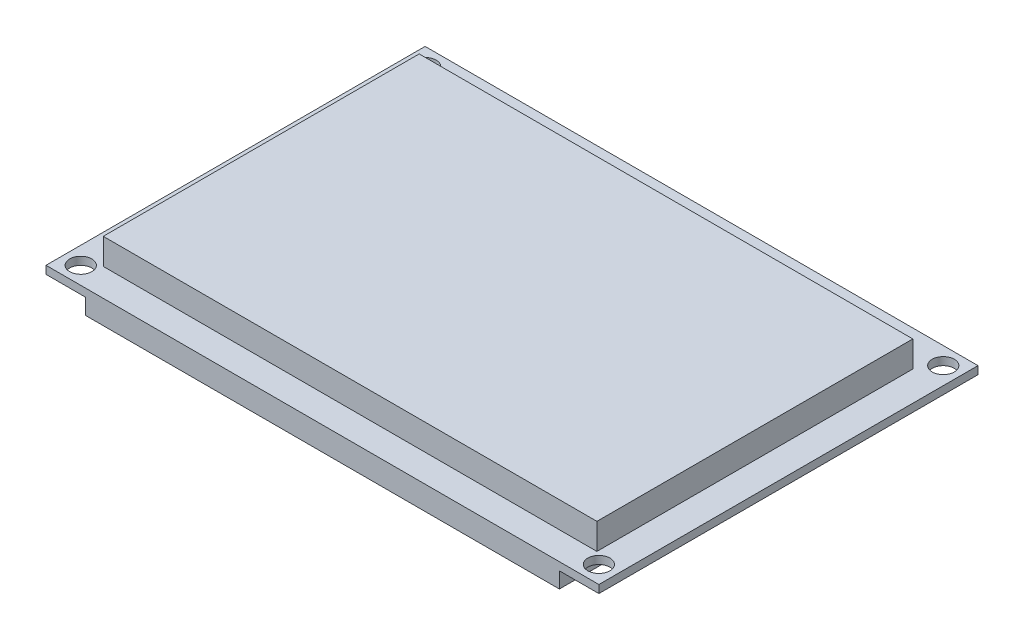
ISO-10303-21;
HEADER;
FILE_DESCRIPTION(('STEP AP214'),'2;1');
FILE_NAME('part.step','',(''),(''),'','','');
FILE_SCHEMA(('AUTOMOTIVE_DESIGN { 1 0 10303 214 1 1 1 1 }'));
ENDSEC;
DATA;
#1=APPLICATION_CONTEXT('core data for automotive mechanical design processes');
#2=APPLICATION_PROTOCOL_DEFINITION('international standard','automotive_design',2000,#1);
#3=PRODUCT_CONTEXT('',#1,'mechanical');
#4=PRODUCT('Part','Part','',(#3));
#5=PRODUCT_RELATED_PRODUCT_CATEGORY('part','',(#4));
#6=PRODUCT_DEFINITION_FORMATION('','',#4);
#7=PRODUCT_DEFINITION_CONTEXT('part definition',#1,'design');
#8=PRODUCT_DEFINITION('design','',#6,#7);
#9=PRODUCT_DEFINITION_SHAPE('','',#8);
#10=(LENGTH_UNIT() NAMED_UNIT(*) SI_UNIT(.MILLI.,.METRE.));
#11=(NAMED_UNIT(*) PLANE_ANGLE_UNIT() SI_UNIT($,.RADIAN.));
#12=(NAMED_UNIT(*) SI_UNIT($,.STERADIAN.) SOLID_ANGLE_UNIT());
#13=UNCERTAINTY_MEASURE_WITH_UNIT(LENGTH_MEASURE(1.E-05),#10,'distance_accuracy_value','');
#14=(GEOMETRIC_REPRESENTATION_CONTEXT(3) GLOBAL_UNCERTAINTY_ASSIGNED_CONTEXT((#13)) GLOBAL_UNIT_ASSIGNED_CONTEXT((#10,
#11,#12)) REPRESENTATION_CONTEXT('',''));
#15=CARTESIAN_POINT('',(0.,0.,0.));
#16=DIRECTION('',(0.,0.,1.));
#17=DIRECTION('',(1.,0.,0.));
#18=AXIS2_PLACEMENT_3D('',#15,#16,#17);
#19=CARTESIAN_POINT('',(0.,0.,0.));
#20=DIRECTION('',(0.,1.,0.));
#21=DIRECTION('',(0.,0.,1.));
#22=AXIS2_PLACEMENT_3D('',#19,#20,#21);
#23=PLANE('',#22);
#24=CARTESIAN_POINT('',(-2.2,0.,-45.8));
#25=DIRECTION('',(0.,1.,0.));
#26=DIRECTION('',(0.,0.,1.));
#27=AXIS2_PLACEMENT_3D('',#24,#25,#26);
#28=CIRCLE('',#27,1.4);
#29=CARTESIAN_POINT('',(-2.2,0.,-44.4));
#30=VERTEX_POINT('',#29);
#31=EDGE_CURVE('E263',#30,#30,#28,.T.);
#32=ORIENTED_EDGE('',*,*,#31,.T.);
#33=EDGE_LOOP('',(#32));
#34=FACE_BOUND('',#33,.T.);
#35=CARTESIAN_POINT('',(-2.2,0.,-2.19999999999999));
#36=DIRECTION('',(0.,1.,0.));
#37=DIRECTION('',(0.,0.,1.));
#38=AXIS2_PLACEMENT_3D('',#35,#36,#37);
#39=CIRCLE('',#38,1.4);
#40=CARTESIAN_POINT('',(-2.2,0.,-0.799999999999992));
#41=VERTEX_POINT('',#40);
#42=EDGE_CURVE('E260',#41,#41,#39,.T.);
#43=ORIENTED_EDGE('',*,*,#42,.T.);
#44=EDGE_LOOP('',(#43));
#45=FACE_BOUND('',#44,.T.);
#46=CARTESIAN_POINT('',(-67.8,0.,-2.19999999999999));
#47=DIRECTION('',(0.,1.,0.));
#48=DIRECTION('',(0.,0.,1.));
#49=AXIS2_PLACEMENT_3D('',#46,#47,#48);
#50=CIRCLE('',#49,1.4);
#51=CARTESIAN_POINT('',(-67.8,0.,-0.799999999999989));
#52=VERTEX_POINT('',#51);
#53=EDGE_CURVE('E257',#52,#52,#50,.T.);
#54=ORIENTED_EDGE('',*,*,#53,.T.);
#55=EDGE_LOOP('',(#54));
#56=FACE_BOUND('',#55,.T.);
#57=CARTESIAN_POINT('',(-67.8,0.,-45.8));
#58=DIRECTION('',(0.,1.,0.));
#59=DIRECTION('',(0.,0.,1.));
#60=AXIS2_PLACEMENT_3D('',#57,#58,#59);
#61=CIRCLE('',#60,1.4);
#62=CARTESIAN_POINT('',(-67.8,0.,-44.4));
#63=VERTEX_POINT('',#62);
#64=EDGE_CURVE('E254',#63,#63,#61,.T.);
#65=ORIENTED_EDGE('',*,*,#64,.T.);
#66=EDGE_LOOP('',(#65));
#67=FACE_BOUND('',#66,.T.);
#68=CARTESIAN_POINT('',(-38.6,0.,-45.2));
#69=DIRECTION('',(0.,1.,0.));
#70=DIRECTION('',(0.,0.,1.));
#71=AXIS2_PLACEMENT_3D('',#68,#69,#70);
#72=CIRCLE('',#71,0.499999999999999);
#73=CARTESIAN_POINT('',(-38.6,0.,-44.7));
#74=VERTEX_POINT('',#73);
#75=EDGE_CURVE('E251',#74,#74,#72,.T.);
#76=ORIENTED_EDGE('',*,*,#75,.T.);
#77=EDGE_LOOP('',(#76));
#78=FACE_BOUND('',#77,.T.);
#79=CARTESIAN_POINT('',(-36.2,0.,-45.2));
#80=DIRECTION('',(0.,1.,0.));
#81=DIRECTION('',(0.,0.,1.));
#82=AXIS2_PLACEMENT_3D('',#79,#80,#81);
#83=CIRCLE('',#82,0.499999999999999);
#84=CARTESIAN_POINT('',(-36.2,0.,-44.7));
#85=VERTEX_POINT('',#84);
#86=EDGE_CURVE('E248',#85,#85,#83,.T.);
#87=ORIENTED_EDGE('',*,*,#86,.T.);
#88=EDGE_LOOP('',(#87));
#89=FACE_BOUND('',#88,.T.);
#90=CARTESIAN_POINT('',(-33.8,0.,-45.2));
#91=DIRECTION('',(0.,1.,0.));
#92=DIRECTION('',(0.,0.,1.));
#93=AXIS2_PLACEMENT_3D('',#90,#91,#92);
#94=CIRCLE('',#93,0.499999999999999);
#95=CARTESIAN_POINT('',(-33.8,0.,-44.7));
#96=VERTEX_POINT('',#95);
#97=EDGE_CURVE('E245',#96,#96,#94,.T.);
#98=ORIENTED_EDGE('',*,*,#97,.T.);
#99=EDGE_LOOP('',(#98));
#100=FACE_BOUND('',#99,.T.);
#101=CARTESIAN_POINT('',(-31.4,0.,-45.2));
#102=DIRECTION('',(0.,1.,0.));
#103=DIRECTION('',(0.,0.,1.));
#104=AXIS2_PLACEMENT_3D('',#101,#102,#103);
#105=CIRCLE('',#104,0.499999999999999);
#106=CARTESIAN_POINT('',(-31.4,0.,-44.7));
#107=VERTEX_POINT('',#106);
#108=EDGE_CURVE('E242',#107,#107,#105,.T.);
#109=ORIENTED_EDGE('',*,*,#108,.T.);
#110=EDGE_LOOP('',(#109));
#111=FACE_BOUND('',#110,.T.);
#112=CARTESIAN_POINT('',(-68.2,0.,-27.6));
#113=DIRECTION('',(0.,1.,0.));
#114=DIRECTION('',(0.,0.,1.));
#115=AXIS2_PLACEMENT_3D('',#112,#113,#114);
#116=CIRCLE('',#115,0.499999999999999);
#117=CARTESIAN_POINT('',(-68.2,0.,-27.1));
#118=VERTEX_POINT('',#117);
#119=EDGE_CURVE('E239',#118,#118,#116,.T.);
#120=ORIENTED_EDGE('',*,*,#119,.T.);
#121=EDGE_LOOP('',(#120));
#122=FACE_BOUND('',#121,.T.);
#123=CARTESIAN_POINT('',(-68.2,0.,-25.2));
#124=DIRECTION('',(0.,1.,0.));
#125=DIRECTION('',(0.,0.,1.));
#126=AXIS2_PLACEMENT_3D('',#123,#124,#125);
#127=CIRCLE('',#126,0.499999999999999);
#128=CARTESIAN_POINT('',(-68.2,0.,-24.7));
#129=VERTEX_POINT('',#128);
#130=EDGE_CURVE('E236',#129,#129,#127,.T.);
#131=ORIENTED_EDGE('',*,*,#130,.T.);
#132=EDGE_LOOP('',(#131));
#133=FACE_BOUND('',#132,.T.);
#134=CARTESIAN_POINT('',(-68.2,0.,-22.8));
#135=DIRECTION('',(0.,1.,0.));
#136=DIRECTION('',(0.,0.,1.));
#137=AXIS2_PLACEMENT_3D('',#134,#135,#136);
#138=CIRCLE('',#137,0.499999999999999);
#139=CARTESIAN_POINT('',(-68.2,0.,-22.3));
#140=VERTEX_POINT('',#139);
#141=EDGE_CURVE('E233',#140,#140,#138,.T.);
#142=ORIENTED_EDGE('',*,*,#141,.T.);
#143=EDGE_LOOP('',(#142));
#144=FACE_BOUND('',#143,.T.);
#145=CARTESIAN_POINT('',(-68.2,0.,-20.4));
#146=DIRECTION('',(0.,1.,0.));
#147=DIRECTION('',(0.,0.,1.));
#148=AXIS2_PLACEMENT_3D('',#145,#146,#147);
#149=CIRCLE('',#148,0.499999999999999);
#150=CARTESIAN_POINT('',(-68.2,0.,-19.9));
#151=VERTEX_POINT('',#150);
#152=EDGE_CURVE('E181',#151,#151,#149,.T.);
#153=ORIENTED_EDGE('',*,*,#152,.T.);
#154=EDGE_LOOP('',(#153));
#155=FACE_BOUND('',#154,.T.);
#156=DIRECTION('',(0.,0.,-1.));
#157=VECTOR('',#156,1.);
#158=CARTESIAN_POINT('',(-65.,0.,-43.));
#159=LINE('',#158,#157);
#160=CARTESIAN_POINT('',(-65.,0.,0.));
#161=VERTEX_POINT('',#160);
#162=CARTESIAN_POINT('',(-65.,0.,-43.));
#163=VERTEX_POINT('',#162);
#164=EDGE_CURVE('E58',#161,#163,#159,.T.);
#165=ORIENTED_EDGE('',*,*,#164,.F.);
#166=DIRECTION('',(-1.,0.,0.));
#167=VECTOR('',#166,1.);
#168=CARTESIAN_POINT('',(0.,0.,0.));
#169=LINE('',#168,#167);
#170=CARTESIAN_POINT('',(-70.,0.,0.));
#171=VERTEX_POINT('',#170);
#172=EDGE_CURVE('E269',#161,#171,#169,.T.);
#173=ORIENTED_EDGE('',*,*,#172,.T.);
#174=DIRECTION('',(0.,0.,-1.));
#175=VECTOR('',#174,1.);
#176=CARTESIAN_POINT('',(-70.,0.,0.));
#177=LINE('',#176,#175);
#178=CARTESIAN_POINT('',(-70.,0.,-48.));
#179=VERTEX_POINT('',#178);
#180=EDGE_CURVE('E266',#171,#179,#177,.T.);
#181=ORIENTED_EDGE('',*,*,#180,.T.);
#182=DIRECTION('',(-1.,0.,0.));
#183=VECTOR('',#182,1.);
#184=CARTESIAN_POINT('',(0.,0.,-48.));
#185=LINE('',#184,#183);
#186=CARTESIAN_POINT('',(0.,0.,-48.));
#187=VERTEX_POINT('',#186);
#188=EDGE_CURVE('E186',#187,#179,#185,.T.);
#189=ORIENTED_EDGE('',*,*,#188,.F.);
#190=DIRECTION('',(0.,0.,-1.));
#191=VECTOR('',#190,1.);
#192=CARTESIAN_POINT('',(0.,0.,0.));
#193=LINE('',#192,#191);
#194=CARTESIAN_POINT('',(0.,0.,0.));
#195=VERTEX_POINT('',#194);
#196=EDGE_CURVE('E272',#195,#187,#193,.T.);
#197=ORIENTED_EDGE('',*,*,#196,.F.);
#198=CARTESIAN_POINT('',(-5.,0.,0.));
#199=VERTEX_POINT('',#198);
#200=EDGE_CURVE('E270',#195,#199,#169,.T.);
#201=ORIENTED_EDGE('',*,*,#200,.T.);
#202=DIRECTION('',(0.,0.,1.));
#203=VECTOR('',#202,1.);
#204=CARTESIAN_POINT('',(-5.,0.,-43.));
#205=LINE('',#204,#203);
#206=CARTESIAN_POINT('',(-5.,0.,-43.));
#207=VERTEX_POINT('',#206);
#208=EDGE_CURVE('E144',#207,#199,#205,.T.);
#209=ORIENTED_EDGE('',*,*,#208,.F.);
#210=DIRECTION('',(1.,0.,0.));
#211=VECTOR('',#210,1.);
#212=CARTESIAN_POINT('',(-65.,0.,-43.));
#213=LINE('',#212,#211);
#214=EDGE_CURVE('E53',#163,#207,#213,.T.);
#215=ORIENTED_EDGE('',*,*,#214,.F.);
#216=EDGE_LOOP('',(#165,#173,#181,#189,#197,#201,#209,#215));
#217=FACE_BOUND('',#216,.T.);
#218=ADVANCED_FACE('F38',(#34,#45,#56,#67,#78,#89,#100,#111,#122,#133,#144,#155,#217),#23,.F.);
#219=CARTESIAN_POINT('',(0.,1.,0.));
#220=DIRECTION('',(0.,1.,0.));
#221=DIRECTION('',(0.,0.,1.));
#222=AXIS2_PLACEMENT_3D('',#219,#220,#221);
#223=PLANE('',#222);
#224=CARTESIAN_POINT('',(-68.2,1.,-20.4));
#225=DIRECTION('',(0.,1.,0.));
#226=DIRECTION('',(0.,0.,1.));
#227=AXIS2_PLACEMENT_3D('',#224,#225,#226);
#228=CIRCLE('',#227,0.499999999999999);
#229=CARTESIAN_POINT('',(-68.2,1.,-19.9));
#230=VERTEX_POINT('',#229);
#231=EDGE_CURVE('E182',#230,#230,#228,.T.);
#232=ORIENTED_EDGE('',*,*,#231,.F.);
#233=EDGE_LOOP('',(#232));
#234=FACE_BOUND('',#233,.T.);
#235=CARTESIAN_POINT('',(-68.2,1.,-22.8));
#236=DIRECTION('',(0.,1.,0.));
#237=DIRECTION('',(0.,0.,1.));
#238=AXIS2_PLACEMENT_3D('',#235,#236,#237);
#239=CIRCLE('',#238,0.499999999999999);
#240=CARTESIAN_POINT('',(-68.2,1.,-22.3));
#241=VERTEX_POINT('',#240);
#242=EDGE_CURVE('E185',#241,#241,#239,.T.);
#243=ORIENTED_EDGE('',*,*,#242,.F.);
#244=EDGE_LOOP('',(#243));
#245=FACE_BOUND('',#244,.T.);
#246=CARTESIAN_POINT('',(-68.2,1.,-25.2));
#247=DIRECTION('',(0.,1.,0.));
#248=DIRECTION('',(0.,0.,1.));
#249=AXIS2_PLACEMENT_3D('',#246,#247,#248);
#250=CIRCLE('',#249,0.499999999999999);
#251=CARTESIAN_POINT('',(-68.2,1.,-24.7));
#252=VERTEX_POINT('',#251);
#253=EDGE_CURVE('E189',#252,#252,#250,.T.);
#254=ORIENTED_EDGE('',*,*,#253,.F.);
#255=EDGE_LOOP('',(#254));
#256=FACE_BOUND('',#255,.T.);
#257=CARTESIAN_POINT('',(-68.2,1.,-27.6));
#258=DIRECTION('',(0.,1.,0.));
#259=DIRECTION('',(0.,0.,1.));
#260=AXIS2_PLACEMENT_3D('',#257,#258,#259);
#261=CIRCLE('',#260,0.499999999999999);
#262=CARTESIAN_POINT('',(-68.2,1.,-27.1));
#263=VERTEX_POINT('',#262);
#264=EDGE_CURVE('E192',#263,#263,#261,.T.);
#265=ORIENTED_EDGE('',*,*,#264,.F.);
#266=EDGE_LOOP('',(#265));
#267=FACE_BOUND('',#266,.T.);
#268=CARTESIAN_POINT('',(-31.4,1.,-45.2));
#269=DIRECTION('',(0.,1.,0.));
#270=DIRECTION('',(0.,0.,1.));
#271=AXIS2_PLACEMENT_3D('',#268,#269,#270);
#272=CIRCLE('',#271,0.499999999999999);
#273=CARTESIAN_POINT('',(-31.4,1.,-44.7));
#274=VERTEX_POINT('',#273);
#275=EDGE_CURVE('E195',#274,#274,#272,.T.);
#276=ORIENTED_EDGE('',*,*,#275,.F.);
#277=EDGE_LOOP('',(#276));
#278=FACE_BOUND('',#277,.T.);
#279=CARTESIAN_POINT('',(-33.8,1.,-45.2));
#280=DIRECTION('',(0.,1.,0.));
#281=DIRECTION('',(0.,0.,1.));
#282=AXIS2_PLACEMENT_3D('',#279,#280,#281);
#283=CIRCLE('',#282,0.499999999999999);
#284=CARTESIAN_POINT('',(-33.8,1.,-44.7));
#285=VERTEX_POINT('',#284);
#286=EDGE_CURVE('E198',#285,#285,#283,.T.);
#287=ORIENTED_EDGE('',*,*,#286,.F.);
#288=EDGE_LOOP('',(#287));
#289=FACE_BOUND('',#288,.T.);
#290=CARTESIAN_POINT('',(-36.2,1.,-45.2));
#291=DIRECTION('',(0.,1.,0.));
#292=DIRECTION('',(0.,0.,1.));
#293=AXIS2_PLACEMENT_3D('',#290,#291,#292);
#294=CIRCLE('',#293,0.499999999999999);
#295=CARTESIAN_POINT('',(-36.2,1.,-44.7));
#296=VERTEX_POINT('',#295);
#297=EDGE_CURVE('E201',#296,#296,#294,.T.);
#298=ORIENTED_EDGE('',*,*,#297,.F.);
#299=EDGE_LOOP('',(#298));
#300=FACE_BOUND('',#299,.T.);
#301=CARTESIAN_POINT('',(-38.6,1.,-45.2));
#302=DIRECTION('',(0.,1.,0.));
#303=DIRECTION('',(0.,0.,1.));
#304=AXIS2_PLACEMENT_3D('',#301,#302,#303);
#305=CIRCLE('',#304,0.499999999999999);
#306=CARTESIAN_POINT('',(-38.6,1.,-44.7));
#307=VERTEX_POINT('',#306);
#308=EDGE_CURVE('E204',#307,#307,#305,.T.);
#309=ORIENTED_EDGE('',*,*,#308,.F.);
#310=EDGE_LOOP('',(#309));
#311=FACE_BOUND('',#310,.T.);
#312=CARTESIAN_POINT('',(-67.8,1.,-45.8));
#313=DIRECTION('',(0.,1.,0.));
#314=DIRECTION('',(0.,0.,1.));
#315=AXIS2_PLACEMENT_3D('',#312,#313,#314);
#316=CIRCLE('',#315,1.4);
#317=CARTESIAN_POINT('',(-67.8,1.,-44.4));
#318=VERTEX_POINT('',#317);
#319=EDGE_CURVE('E207',#318,#318,#316,.T.);
#320=ORIENTED_EDGE('',*,*,#319,.F.);
#321=EDGE_LOOP('',(#320));
#322=FACE_BOUND('',#321,.T.);
#323=CARTESIAN_POINT('',(-67.8,1.,-2.19999999999999));
#324=DIRECTION('',(0.,1.,0.));
#325=DIRECTION('',(0.,0.,1.));
#326=AXIS2_PLACEMENT_3D('',#323,#324,#325);
#327=CIRCLE('',#326,1.4);
#328=CARTESIAN_POINT('',(-67.8,1.,-0.799999999999989));
#329=VERTEX_POINT('',#328);
#330=EDGE_CURVE('E210',#329,#329,#327,.T.);
#331=ORIENTED_EDGE('',*,*,#330,.F.);
#332=EDGE_LOOP('',(#331));
#333=FACE_BOUND('',#332,.T.);
#334=CARTESIAN_POINT('',(-2.2,1.,-2.19999999999999));
#335=DIRECTION('',(0.,1.,0.));
#336=DIRECTION('',(0.,0.,1.));
#337=AXIS2_PLACEMENT_3D('',#334,#335,#336);
#338=CIRCLE('',#337,1.4);
#339=CARTESIAN_POINT('',(-2.2,1.,-0.799999999999992));
#340=VERTEX_POINT('',#339);
#341=EDGE_CURVE('E213',#340,#340,#338,.T.);
#342=ORIENTED_EDGE('',*,*,#341,.F.);
#343=EDGE_LOOP('',(#342));
#344=FACE_BOUND('',#343,.T.);
#345=CARTESIAN_POINT('',(-2.2,1.,-45.8));
#346=DIRECTION('',(0.,1.,0.));
#347=DIRECTION('',(0.,0.,1.));
#348=AXIS2_PLACEMENT_3D('',#345,#346,#347);
#349=CIRCLE('',#348,1.4);
#350=CARTESIAN_POINT('',(-2.2,1.,-44.4));
#351=VERTEX_POINT('',#350);
#352=EDGE_CURVE('E216',#351,#351,#349,.T.);
#353=ORIENTED_EDGE('',*,*,#352,.F.);
#354=EDGE_LOOP('',(#353));
#355=FACE_BOUND('',#354,.T.);
#356=DIRECTION('',(0.,0.,-1.));
#357=VECTOR('',#356,1.);
#358=CARTESIAN_POINT('',(-70.,1.,0.));
#359=LINE('',#358,#357);
#360=CARTESIAN_POINT('',(-70.,1.,0.));
#361=VERTEX_POINT('',#360);
#362=CARTESIAN_POINT('',(-70.,1.,-48.));
#363=VERTEX_POINT('',#362);
#364=EDGE_CURVE('E219',#361,#363,#359,.T.);
#365=ORIENTED_EDGE('',*,*,#364,.F.);
#366=DIRECTION('',(-1.,0.,0.));
#367=VECTOR('',#366,1.);
#368=CARTESIAN_POINT('',(0.,1.,0.));
#369=LINE('',#368,#367);
#370=CARTESIAN_POINT('',(0.,1.,0.));
#371=VERTEX_POINT('',#370);
#372=EDGE_CURVE('E222',#371,#361,#369,.T.);
#373=ORIENTED_EDGE('',*,*,#372,.F.);
#374=DIRECTION('',(0.,0.,-1.));
#375=VECTOR('',#374,1.);
#376=CARTESIAN_POINT('',(0.,1.,0.));
#377=LINE('',#376,#375);
#378=CARTESIAN_POINT('',(0.,1.,-48.));
#379=VERTEX_POINT('',#378);
#380=EDGE_CURVE('E225',#371,#379,#377,.T.);
#381=ORIENTED_EDGE('',*,*,#380,.T.);
#382=DIRECTION('',(-1.,0.,0.));
#383=VECTOR('',#382,1.);
#384=CARTESIAN_POINT('',(0.,1.,-48.));
#385=LINE('',#384,#383);
#386=EDGE_CURVE('E228',#379,#363,#385,.T.);
#387=ORIENTED_EDGE('',*,*,#386,.T.);
#388=EDGE_LOOP('',(#365,#373,#381,#387));
#389=FACE_BOUND('',#388,.T.);
#390=DIRECTION('',(1.,0.,0.));
#391=VECTOR('',#390,1.);
#392=CARTESIAN_POINT('',(-66.25,1.,-3.49999999999999));
#393=LINE('',#392,#391);
#394=CARTESIAN_POINT('',(-66.25,1.,-3.49999999999999));
#395=VERTEX_POINT('',#394);
#396=CARTESIAN_POINT('',(-3.75,1.,-3.49999999999999));
#397=VERTEX_POINT('',#396);
#398=EDGE_CURVE('E150',#395,#397,#393,.T.);
#399=ORIENTED_EDGE('',*,*,#398,.F.);
#400=DIRECTION('',(0.,0.,1.));
#401=VECTOR('',#400,1.);
#402=CARTESIAN_POINT('',(-66.25,1.,-43.5));
#403=LINE('',#402,#401);
#404=CARTESIAN_POINT('',(-66.25,1.,-43.5));
#405=VERTEX_POINT('',#404);
#406=EDGE_CURVE('E147',#405,#395,#403,.T.);
#407=ORIENTED_EDGE('',*,*,#406,.F.);
#408=DIRECTION('',(-1.,0.,0.));
#409=VECTOR('',#408,1.);
#410=CARTESIAN_POINT('',(-66.25,1.,-43.5));
#411=LINE('',#410,#409);
#412=CARTESIAN_POINT('',(-3.75,1.,-43.5));
#413=VERTEX_POINT('',#412);
#414=EDGE_CURVE('E160',#413,#405,#411,.T.);
#415=ORIENTED_EDGE('',*,*,#414,.F.);
#416=DIRECTION('',(0.,0.,-1.));
#417=VECTOR('',#416,1.);
#418=CARTESIAN_POINT('',(-3.75,1.,-43.5));
#419=LINE('',#418,#417);
#420=EDGE_CURVE('E168',#397,#413,#419,.T.);
#421=ORIENTED_EDGE('',*,*,#420,.F.);
#422=EDGE_LOOP('',(#399,#407,#415,#421));
#423=FACE_BOUND('',#422,.T.);
#424=ADVANCED_FACE('F310',(#234,#245,#256,#267,#278,#289,#300,#311,#322,#333,#344,#355,#389,
#423),#223,.T.);
#425=CARTESIAN_POINT('',(-70.,1.,0.));
#426=DIRECTION('',(-1.,0.,0.));
#427=DIRECTION('',(0.,0.,1.));
#428=AXIS2_PLACEMENT_3D('',#425,#426,#427);
#429=PLANE('',#428);
#430=ORIENTED_EDGE('',*,*,#180,.F.);
#431=DIRECTION('',(0.,-1.,0.));
#432=VECTOR('',#431,1.);
#433=CARTESIAN_POINT('',(-70.,1.,0.));
#434=LINE('',#433,#432);
#435=EDGE_CURVE('E11',#361,#171,#434,.T.);
#436=ORIENTED_EDGE('',*,*,#435,.F.);
#437=ORIENTED_EDGE('',*,*,#364,.T.);
#438=DIRECTION('',(0.,-1.,0.));
#439=VECTOR('',#438,1.);
#440=CARTESIAN_POINT('',(-70.,1.,-48.));
#441=LINE('',#440,#439);
#442=EDGE_CURVE('E230',#363,#179,#441,.T.);
#443=ORIENTED_EDGE('',*,*,#442,.T.);
#444=EDGE_LOOP('',(#430,#436,#437,#443));
#445=FACE_BOUND('',#444,.T.);
#446=ADVANCED_FACE('F316',(#445),#429,.T.);
#447=CARTESIAN_POINT('',(0.,1.,0.));
#448=DIRECTION('',(0.,0.,1.));
#449=DIRECTION('',(1.,0.,0.));
#450=AXIS2_PLACEMENT_3D('',#447,#448,#449);
#451=PLANE('',#450);
#452=ORIENTED_EDGE('',*,*,#200,.F.);
#453=DIRECTION('',(0.,-1.,0.));
#454=VECTOR('',#453,1.);
#455=CARTESIAN_POINT('',(0.,1.,0.));
#456=LINE('',#455,#454);
#457=EDGE_CURVE('E46',#371,#195,#456,.T.);
#458=ORIENTED_EDGE('',*,*,#457,.F.);
#459=ORIENTED_EDGE('',*,*,#372,.T.);
#460=ORIENTED_EDGE('',*,*,#435,.T.);
#461=ORIENTED_EDGE('',*,*,#172,.F.);
#462=DIRECTION('',(0.,1.,0.));
#463=VECTOR('',#462,1.);
#464=CARTESIAN_POINT('',(-65.,-2.,0.));
#465=LINE('',#464,#463);
#466=CARTESIAN_POINT('',(-65.,-2.,0.));
#467=VERTEX_POINT('',#466);
#468=EDGE_CURVE('E293',#467,#161,#465,.T.);
#469=ORIENTED_EDGE('',*,*,#468,.F.);
#470=DIRECTION('',(-1.,0.,0.));
#471=VECTOR('',#470,1.);
#472=CARTESIAN_POINT('',(-65.,-2.,0.));
#473=LINE('',#472,#471);
#474=CARTESIAN_POINT('',(-5.,-2.,0.));
#475=VERTEX_POINT('',#474);
#476=EDGE_CURVE('E140',#475,#467,#473,.T.);
#477=ORIENTED_EDGE('',*,*,#476,.F.);
#478=DIRECTION('',(0.,1.,0.));
#479=VECTOR('',#478,1.);
#480=CARTESIAN_POINT('',(-5.,-2.,0.));
#481=LINE('',#480,#479);
#482=EDGE_CURVE('E152',#475,#199,#481,.T.);
#483=ORIENTED_EDGE('',*,*,#482,.T.);
#484=EDGE_LOOP('',(#452,#458,#459,#460,#461,#469,#477,#483));
#485=FACE_BOUND('',#484,.T.);
#486=ADVANCED_FACE('F290',(#485),#451,.T.);
#487=CARTESIAN_POINT('',(0.,1.,0.));
#488=DIRECTION('',(-1.,0.,0.));
#489=DIRECTION('',(0.,0.,1.));
#490=AXIS2_PLACEMENT_3D('',#487,#488,#489);
#491=PLANE('',#490);
#492=ORIENTED_EDGE('',*,*,#196,.T.);
#493=DIRECTION('',(0.,-1.,0.));
#494=VECTOR('',#493,1.);
#495=CARTESIAN_POINT('',(0.,1.,-48.));
#496=LINE('',#495,#494);
#497=EDGE_CURVE('E278',#379,#187,#496,.T.);
#498=ORIENTED_EDGE('',*,*,#497,.F.);
#499=ORIENTED_EDGE('',*,*,#380,.F.);
#500=ORIENTED_EDGE('',*,*,#457,.T.);
#501=EDGE_LOOP('',(#492,#498,#499,#500));
#502=FACE_BOUND('',#501,.T.);
#503=ADVANCED_FACE('F283',(#502),#491,.F.);
#504=CARTESIAN_POINT('',(-2.2,1.,-45.8));
#505=DIRECTION('',(0.,-1.,0.));
#506=DIRECTION('',(0.,0.,-1.));
#507=AXIS2_PLACEMENT_3D('',#504,#505,#506);
#508=CYLINDRICAL_SURFACE('',#507,1.4);
#509=ORIENTED_EDGE('',*,*,#352,.T.);
#510=EDGE_LOOP('',(#509));
#511=FACE_BOUND('',#510,.T.);
#512=ORIENTED_EDGE('',*,*,#31,.F.);
#513=EDGE_LOOP('',(#512));
#514=FACE_BOUND('',#513,.T.);
#515=ADVANCED_FACE('F329',(#511,#514),#508,.F.);
#516=CARTESIAN_POINT('',(-2.2,1.,-2.19999999999999));
#517=DIRECTION('',(0.,-1.,0.));
#518=DIRECTION('',(0.,0.,-1.));
#519=AXIS2_PLACEMENT_3D('',#516,#517,#518);
#520=CYLINDRICAL_SURFACE('',#519,1.4);
#521=ORIENTED_EDGE('',*,*,#341,.T.);
#522=EDGE_LOOP('',(#521));
#523=FACE_BOUND('',#522,.T.);
#524=ORIENTED_EDGE('',*,*,#42,.F.);
#525=EDGE_LOOP('',(#524));
#526=FACE_BOUND('',#525,.T.);
#527=ADVANCED_FACE('F337',(#523,#526),#520,.F.);
#528=CARTESIAN_POINT('',(-67.8,1.,-2.19999999999999));
#529=DIRECTION('',(0.,-1.,0.));
#530=DIRECTION('',(0.,0.,-1.));
#531=AXIS2_PLACEMENT_3D('',#528,#529,#530);
#532=CYLINDRICAL_SURFACE('',#531,1.4);
#533=ORIENTED_EDGE('',*,*,#330,.T.);
#534=EDGE_LOOP('',(#533));
#535=FACE_BOUND('',#534,.T.);
#536=ORIENTED_EDGE('',*,*,#53,.F.);
#537=EDGE_LOOP('',(#536));
#538=FACE_BOUND('',#537,.T.);
#539=ADVANCED_FACE('F341',(#535,#538),#532,.F.);
#540=CARTESIAN_POINT('',(-67.8,1.,-45.8));
#541=DIRECTION('',(0.,-1.,0.));
#542=DIRECTION('',(0.,0.,-1.));
#543=AXIS2_PLACEMENT_3D('',#540,#541,#542);
#544=CYLINDRICAL_SURFACE('',#543,1.4);
#545=ORIENTED_EDGE('',*,*,#319,.T.);
#546=EDGE_LOOP('',(#545));
#547=FACE_BOUND('',#546,.T.);
#548=ORIENTED_EDGE('',*,*,#64,.F.);
#549=EDGE_LOOP('',(#548));
#550=FACE_BOUND('',#549,.T.);
#551=ADVANCED_FACE('F345',(#547,#550),#544,.F.);
#552=CARTESIAN_POINT('',(-38.6,1.,-45.2));
#553=DIRECTION('',(0.,-1.,0.));
#554=DIRECTION('',(0.,0.,-1.));
#555=AXIS2_PLACEMENT_3D('',#552,#553,#554);
#556=CYLINDRICAL_SURFACE('',#555,0.499999999999999);
#557=ORIENTED_EDGE('',*,*,#308,.T.);
#558=EDGE_LOOP('',(#557));
#559=FACE_BOUND('',#558,.T.);
#560=ORIENTED_EDGE('',*,*,#75,.F.);
#561=EDGE_LOOP('',(#560));
#562=FACE_BOUND('',#561,.T.);
#563=ADVANCED_FACE('F349',(#559,#562),#556,.F.);
#564=CARTESIAN_POINT('',(-36.2,1.,-45.2));
#565=DIRECTION('',(0.,-1.,0.));
#566=DIRECTION('',(0.,0.,-1.));
#567=AXIS2_PLACEMENT_3D('',#564,#565,#566);
#568=CYLINDRICAL_SURFACE('',#567,0.499999999999999);
#569=ORIENTED_EDGE('',*,*,#297,.T.);
#570=EDGE_LOOP('',(#569));
#571=FACE_BOUND('',#570,.T.);
#572=ORIENTED_EDGE('',*,*,#86,.F.);
#573=EDGE_LOOP('',(#572));
#574=FACE_BOUND('',#573,.T.);
#575=ADVANCED_FACE('F353',(#571,#574),#568,.F.);
#576=CARTESIAN_POINT('',(-33.8,1.,-45.2));
#577=DIRECTION('',(0.,-1.,0.));
#578=DIRECTION('',(0.,0.,-1.));
#579=AXIS2_PLACEMENT_3D('',#576,#577,#578);
#580=CYLINDRICAL_SURFACE('',#579,0.499999999999999);
#581=ORIENTED_EDGE('',*,*,#286,.T.);
#582=EDGE_LOOP('',(#581));
#583=FACE_BOUND('',#582,.T.);
#584=ORIENTED_EDGE('',*,*,#97,.F.);
#585=EDGE_LOOP('',(#584));
#586=FACE_BOUND('',#585,.T.);
#587=ADVANCED_FACE('F357',(#583,#586),#580,.F.);
#588=CARTESIAN_POINT('',(-31.4,1.,-45.2));
#589=DIRECTION('',(0.,-1.,0.));
#590=DIRECTION('',(0.,0.,-1.));
#591=AXIS2_PLACEMENT_3D('',#588,#589,#590);
#592=CYLINDRICAL_SURFACE('',#591,0.499999999999999);
#593=ORIENTED_EDGE('',*,*,#275,.T.);
#594=EDGE_LOOP('',(#593));
#595=FACE_BOUND('',#594,.T.);
#596=ORIENTED_EDGE('',*,*,#108,.F.);
#597=EDGE_LOOP('',(#596));
#598=FACE_BOUND('',#597,.T.);
#599=ADVANCED_FACE('F361',(#595,#598),#592,.F.);
#600=CARTESIAN_POINT('',(-68.2,1.,-27.6));
#601=DIRECTION('',(0.,-1.,0.));
#602=DIRECTION('',(0.,0.,-1.));
#603=AXIS2_PLACEMENT_3D('',#600,#601,#602);
#604=CYLINDRICAL_SURFACE('',#603,0.499999999999999);
#605=ORIENTED_EDGE('',*,*,#264,.T.);
#606=EDGE_LOOP('',(#605));
#607=FACE_BOUND('',#606,.T.);
#608=ORIENTED_EDGE('',*,*,#119,.F.);
#609=EDGE_LOOP('',(#608));
#610=FACE_BOUND('',#609,.T.);
#611=ADVANCED_FACE('F365',(#607,#610),#604,.F.);
#612=CARTESIAN_POINT('',(-68.2,1.,-25.2));
#613=DIRECTION('',(0.,-1.,0.));
#614=DIRECTION('',(0.,0.,-1.));
#615=AXIS2_PLACEMENT_3D('',#612,#613,#614);
#616=CYLINDRICAL_SURFACE('',#615,0.499999999999999);
#617=ORIENTED_EDGE('',*,*,#253,.T.);
#618=EDGE_LOOP('',(#617));
#619=FACE_BOUND('',#618,.T.);
#620=ORIENTED_EDGE('',*,*,#130,.F.);
#621=EDGE_LOOP('',(#620));
#622=FACE_BOUND('',#621,.T.);
#623=ADVANCED_FACE('F369',(#619,#622),#616,.F.);
#624=CARTESIAN_POINT('',(-68.2,1.,-22.8));
#625=DIRECTION('',(0.,-1.,0.));
#626=DIRECTION('',(0.,0.,-1.));
#627=AXIS2_PLACEMENT_3D('',#624,#625,#626);
#628=CYLINDRICAL_SURFACE('',#627,0.499999999999999);
#629=ORIENTED_EDGE('',*,*,#242,.T.);
#630=EDGE_LOOP('',(#629));
#631=FACE_BOUND('',#630,.T.);
#632=ORIENTED_EDGE('',*,*,#141,.F.);
#633=EDGE_LOOP('',(#632));
#634=FACE_BOUND('',#633,.T.);
#635=ADVANCED_FACE('F372',(#631,#634),#628,.F.);
#636=CARTESIAN_POINT('',(-68.2,1.,-20.4));
#637=DIRECTION('',(0.,-1.,0.));
#638=DIRECTION('',(0.,0.,-1.));
#639=AXIS2_PLACEMENT_3D('',#636,#637,#638);
#640=CYLINDRICAL_SURFACE('',#639,0.499999999999999);
#641=ORIENTED_EDGE('',*,*,#231,.T.);
#642=EDGE_LOOP('',(#641));
#643=FACE_BOUND('',#642,.T.);
#644=ORIENTED_EDGE('',*,*,#152,.F.);
#645=EDGE_LOOP('',(#644));
#646=FACE_BOUND('',#645,.T.);
#647=ADVANCED_FACE('F40',(#643,#646),#640,.F.);
#648=CARTESIAN_POINT('',(0.,1.,-48.));
#649=DIRECTION('',(0.,0.,1.));
#650=DIRECTION('',(1.,0.,0.));
#651=AXIS2_PLACEMENT_3D('',#648,#649,#650);
#652=PLANE('',#651);
#653=ORIENTED_EDGE('',*,*,#188,.T.);
#654=ORIENTED_EDGE('',*,*,#442,.F.);
#655=ORIENTED_EDGE('',*,*,#386,.F.);
#656=ORIENTED_EDGE('',*,*,#497,.T.);
#657=EDGE_LOOP('',(#653,#654,#655,#656));
#658=FACE_BOUND('',#657,.T.);
#659=ADVANCED_FACE('F322',(#658),#652,.F.);
#660=CARTESIAN_POINT('',(-66.25,4.3,-43.5));
#661=DIRECTION('',(1.,0.,0.));
#662=DIRECTION('',(0.,0.,-1.));
#663=AXIS2_PLACEMENT_3D('',#660,#661,#662);
#664=PLANE('',#663);
#665=ORIENTED_EDGE('',*,*,#406,.T.);
#666=DIRECTION('',(0.,-1.,0.));
#667=VECTOR('',#666,1.);
#668=CARTESIAN_POINT('',(-66.25,4.3,-3.49999999999999));
#669=LINE('',#668,#667);
#670=CARTESIAN_POINT('',(-66.25,4.3,-3.49999999999999));
#671=VERTEX_POINT('',#670);
#672=EDGE_CURVE('E179',#671,#395,#669,.T.);
#673=ORIENTED_EDGE('',*,*,#672,.F.);
#674=DIRECTION('',(0.,0.,1.));
#675=VECTOR('',#674,1.);
#676=CARTESIAN_POINT('',(-66.25,4.3,-43.5));
#677=LINE('',#676,#675);
#678=CARTESIAN_POINT('',(-66.25,4.3,-43.5));
#679=VERTEX_POINT('',#678);
#680=EDGE_CURVE('E156',#679,#671,#677,.T.);
#681=ORIENTED_EDGE('',*,*,#680,.F.);
#682=DIRECTION('',(0.,-1.,0.));
#683=VECTOR('',#682,1.);
#684=CARTESIAN_POINT('',(-66.25,4.3,-43.5));
#685=LINE('',#684,#683);
#686=EDGE_CURVE('E165',#679,#405,#685,.T.);
#687=ORIENTED_EDGE('',*,*,#686,.T.);
#688=EDGE_LOOP('',(#665,#673,#681,#687));
#689=FACE_BOUND('',#688,.T.);
#690=ADVANCED_FACE('F325',(#689),#664,.F.);
#691=CARTESIAN_POINT('',(-66.25,4.3,-3.49999999999999));
#692=DIRECTION('',(0.,0.,-1.));
#693=DIRECTION('',(-1.,0.,0.));
#694=AXIS2_PLACEMENT_3D('',#691,#692,#693);
#695=PLANE('',#694);
#696=ORIENTED_EDGE('',*,*,#398,.T.);
#697=DIRECTION('',(0.,-1.,0.));
#698=VECTOR('',#697,1.);
#699=CARTESIAN_POINT('',(-3.75,4.3,-3.49999999999999));
#700=LINE('',#699,#698);
#701=CARTESIAN_POINT('',(-3.75,4.3,-3.49999999999999));
#702=VERTEX_POINT('',#701);
#703=EDGE_CURVE('E176',#702,#397,#700,.T.);
#704=ORIENTED_EDGE('',*,*,#703,.F.);
#705=DIRECTION('',(1.,0.,0.));
#706=VECTOR('',#705,1.);
#707=CARTESIAN_POINT('',(-66.25,4.3,-3.49999999999999));
#708=LINE('',#707,#706);
#709=EDGE_CURVE('E159',#671,#702,#708,.T.);
#710=ORIENTED_EDGE('',*,*,#709,.F.);
#711=ORIENTED_EDGE('',*,*,#672,.T.);
#712=EDGE_LOOP('',(#696,#704,#710,#711));
#713=FACE_BOUND('',#712,.T.);
#714=ADVANCED_FACE('F417',(#713),#695,.F.);
#715=CARTESIAN_POINT('',(-3.75,4.3,-43.5));
#716=DIRECTION('',(-1.,0.,0.));
#717=DIRECTION('',(0.,0.,1.));
#718=AXIS2_PLACEMENT_3D('',#715,#716,#717);
#719=PLANE('',#718);
#720=ORIENTED_EDGE('',*,*,#420,.T.);
#721=DIRECTION('',(0.,-1.,0.));
#722=VECTOR('',#721,1.);
#723=CARTESIAN_POINT('',(-3.75,4.3,-43.5));
#724=LINE('',#723,#722);
#725=CARTESIAN_POINT('',(-3.75,4.3,-43.5));
#726=VERTEX_POINT('',#725);
#727=EDGE_CURVE('E174',#726,#413,#724,.T.);
#728=ORIENTED_EDGE('',*,*,#727,.F.);
#729=DIRECTION('',(0.,0.,-1.));
#730=VECTOR('',#729,1.);
#731=CARTESIAN_POINT('',(-3.75,4.3,-43.5));
#732=LINE('',#731,#730);
#733=EDGE_CURVE('E162',#702,#726,#732,.T.);
#734=ORIENTED_EDGE('',*,*,#733,.F.);
#735=ORIENTED_EDGE('',*,*,#703,.T.);
#736=EDGE_LOOP('',(#720,#728,#734,#735));
#737=FACE_BOUND('',#736,.T.);
#738=ADVANCED_FACE('F421',(#737),#719,.F.);
#739=CARTESIAN_POINT('',(-66.25,4.3,-43.5));
#740=DIRECTION('',(0.,0.,1.));
#741=DIRECTION('',(1.,0.,0.));
#742=AXIS2_PLACEMENT_3D('',#739,#740,#741);
#743=PLANE('',#742);
#744=ORIENTED_EDGE('',*,*,#414,.T.);
#745=ORIENTED_EDGE('',*,*,#686,.F.);
#746=DIRECTION('',(-1.,0.,0.));
#747=VECTOR('',#746,1.);
#748=CARTESIAN_POINT('',(-66.25,4.3,-43.5));
#749=LINE('',#748,#747);
#750=EDGE_CURVE('E164',#726,#679,#749,.T.);
#751=ORIENTED_EDGE('',*,*,#750,.F.);
#752=ORIENTED_EDGE('',*,*,#727,.T.);
#753=EDGE_LOOP('',(#744,#745,#751,#752));
#754=FACE_BOUND('',#753,.T.);
#755=ADVANCED_FACE('F430',(#754),#743,.F.);
#756=CARTESIAN_POINT('',(0.,4.3,0.));
#757=DIRECTION('',(0.,1.,0.));
#758=DIRECTION('',(0.,0.,1.));
#759=AXIS2_PLACEMENT_3D('',#756,#757,#758);
#760=PLANE('',#759);
#761=ORIENTED_EDGE('',*,*,#680,.T.);
#762=ORIENTED_EDGE('',*,*,#709,.T.);
#763=ORIENTED_EDGE('',*,*,#733,.T.);
#764=ORIENTED_EDGE('',*,*,#750,.T.);
#765=EDGE_LOOP('',(#761,#762,#763,#764));
#766=FACE_BOUND('',#765,.T.);
#767=ADVANCED_FACE('F425',(#766),#760,.T.);
#768=CARTESIAN_POINT('',(-65.,-2.,-43.));
#769=DIRECTION('',(1.,0.,0.));
#770=DIRECTION('',(0.,0.,-1.));
#771=AXIS2_PLACEMENT_3D('',#768,#769,#770);
#772=PLANE('',#771);
#773=ORIENTED_EDGE('',*,*,#164,.T.);
#774=DIRECTION('',(0.,1.,0.));
#775=VECTOR('',#774,1.);
#776=CARTESIAN_POINT('',(-65.,-2.,-43.));
#777=LINE('',#776,#775);
#778=CARTESIAN_POINT('',(-65.,-2.,-43.));
#779=VERTEX_POINT('',#778);
#780=EDGE_CURVE('E129',#779,#163,#777,.T.);
#781=ORIENTED_EDGE('',*,*,#780,.F.);
#782=DIRECTION('',(0.,0.,-1.));
#783=VECTOR('',#782,1.);
#784=CARTESIAN_POINT('',(-65.,-2.,-43.));
#785=LINE('',#784,#783);
#786=EDGE_CURVE('E135',#467,#779,#785,.T.);
#787=ORIENTED_EDGE('',*,*,#786,.F.);
#788=ORIENTED_EDGE('',*,*,#468,.T.);
#789=EDGE_LOOP('',(#773,#781,#787,#788));
#790=FACE_BOUND('',#789,.T.);
#791=ADVANCED_FACE('F146',(#790),#772,.F.);
#792=CARTESIAN_POINT('',(-65.,-2.,-43.));
#793=DIRECTION('',(0.,0.,1.));
#794=DIRECTION('',(1.,0.,0.));
#795=AXIS2_PLACEMENT_3D('',#792,#793,#794);
#796=PLANE('',#795);
#797=ORIENTED_EDGE('',*,*,#214,.T.);
#798=DIRECTION('',(0.,1.,0.));
#799=VECTOR('',#798,1.);
#800=CARTESIAN_POINT('',(-5.,-2.,-43.));
#801=LINE('',#800,#799);
#802=CARTESIAN_POINT('',(-5.,-2.,-43.));
#803=VERTEX_POINT('',#802);
#804=EDGE_CURVE('E131',#803,#207,#801,.T.);
#805=ORIENTED_EDGE('',*,*,#804,.F.);
#806=DIRECTION('',(1.,0.,0.));
#807=VECTOR('',#806,1.);
#808=CARTESIAN_POINT('',(-65.,-2.,-43.));
#809=LINE('',#808,#807);
#810=EDGE_CURVE('E125',#779,#803,#809,.T.);
#811=ORIENTED_EDGE('',*,*,#810,.F.);
#812=ORIENTED_EDGE('',*,*,#780,.T.);
#813=EDGE_LOOP('',(#797,#805,#811,#812));
#814=FACE_BOUND('',#813,.T.);
#815=ADVANCED_FACE('F127',(#814),#796,.F.);
#816=CARTESIAN_POINT('',(-5.,-2.,-43.));
#817=DIRECTION('',(-1.,0.,0.));
#818=DIRECTION('',(0.,0.,1.));
#819=AXIS2_PLACEMENT_3D('',#816,#817,#818);
#820=PLANE('',#819);
#821=ORIENTED_EDGE('',*,*,#208,.T.);
#822=ORIENTED_EDGE('',*,*,#482,.F.);
#823=DIRECTION('',(0.,0.,1.));
#824=VECTOR('',#823,1.);
#825=CARTESIAN_POINT('',(-5.,-2.,-43.));
#826=LINE('',#825,#824);
#827=EDGE_CURVE('E134',#803,#475,#826,.T.);
#828=ORIENTED_EDGE('',*,*,#827,.F.);
#829=ORIENTED_EDGE('',*,*,#804,.T.);
#830=EDGE_LOOP('',(#821,#822,#828,#829));
#831=FACE_BOUND('',#830,.T.);
#832=ADVANCED_FACE('F300',(#831),#820,.F.);
#833=CARTESIAN_POINT('',(0.,-2.,0.));
#834=DIRECTION('',(0.,1.,0.));
#835=DIRECTION('',(0.,0.,1.));
#836=AXIS2_PLACEMENT_3D('',#833,#834,#835);
#837=PLANE('',#836);
#838=ORIENTED_EDGE('',*,*,#786,.T.);
#839=ORIENTED_EDGE('',*,*,#810,.T.);
#840=ORIENTED_EDGE('',*,*,#827,.T.);
#841=ORIENTED_EDGE('',*,*,#476,.T.);
#842=EDGE_LOOP('',(#838,#839,#840,#841));
#843=FACE_BOUND('',#842,.T.);
#844=ADVANCED_FACE('F138',(#843),#837,.F.);
#845=CLOSED_SHELL('',(#218,#424,#446,#486,#503,#515,#527,#539,#551,#563,#575,#587,#599,#611,
#623,#635,#647,#659,#690,#714,#738,#755,#767,#791,#815,#832,#844));
#846=MANIFOLD_SOLID_BREP('B2',#845);
#847=ADVANCED_BREP_SHAPE_REPRESENTATION('',(#18,#846),#14);
#848=SHAPE_DEFINITION_REPRESENTATION(#9,#847);
ENDSEC;
END-ISO-10303-21;
